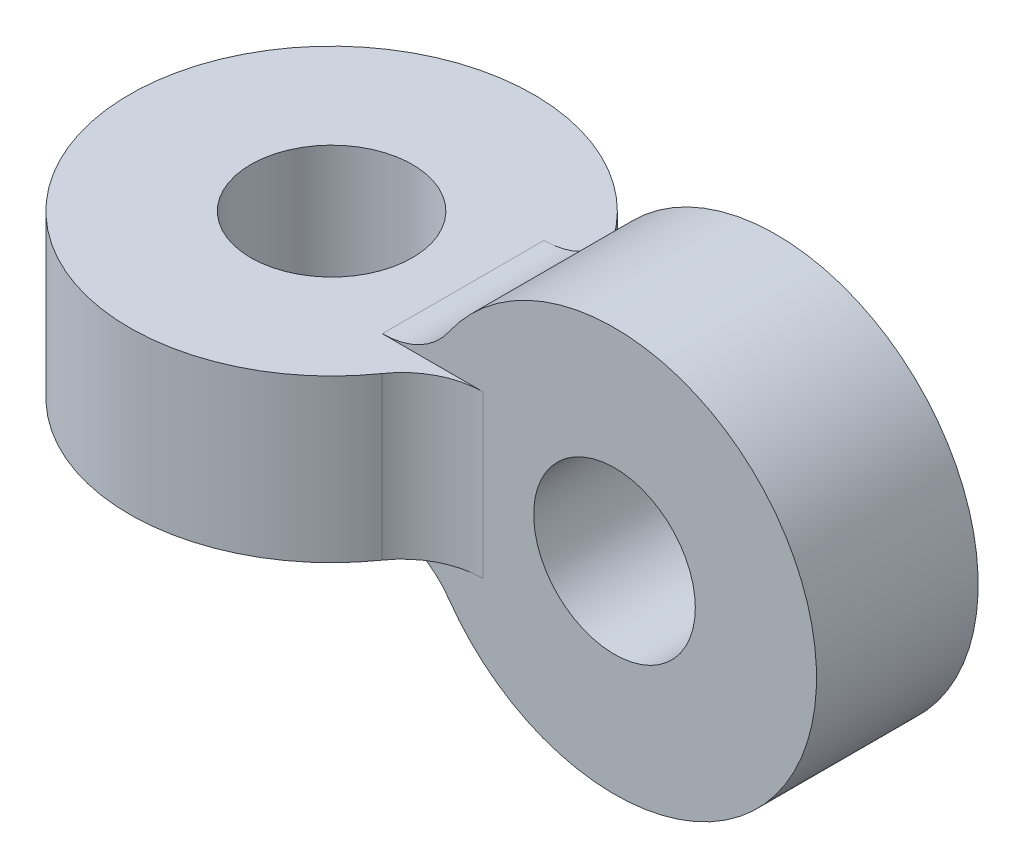
ISO-10303-21;
HEADER;
FILE_DESCRIPTION(('STEP AP214'),'2;1');
FILE_NAME('part.step','',(''),(''),'','','');
FILE_SCHEMA(('AUTOMOTIVE_DESIGN { 1 0 10303 214 1 1 1 1 }'));
ENDSEC;
DATA;
#1=APPLICATION_CONTEXT('core data for automotive mechanical design processes');
#2=APPLICATION_PROTOCOL_DEFINITION('international standard','automotive_design',2000,#1);
#3=PRODUCT_CONTEXT('',#1,'mechanical');
#4=PRODUCT('Part','Part','',(#3));
#5=PRODUCT_RELATED_PRODUCT_CATEGORY('part','',(#4));
#6=PRODUCT_DEFINITION_FORMATION('','',#4);
#7=PRODUCT_DEFINITION_CONTEXT('part definition',#1,'design');
#8=PRODUCT_DEFINITION('design','',#6,#7);
#9=PRODUCT_DEFINITION_SHAPE('','',#8);
#10=(LENGTH_UNIT() NAMED_UNIT(*) SI_UNIT(.MILLI.,.METRE.));
#11=(NAMED_UNIT(*) PLANE_ANGLE_UNIT() SI_UNIT($,.RADIAN.));
#12=(NAMED_UNIT(*) SI_UNIT($,.STERADIAN.) SOLID_ANGLE_UNIT());
#13=UNCERTAINTY_MEASURE_WITH_UNIT(LENGTH_MEASURE(1.E-05),#10,'distance_accuracy_value','');
#14=(GEOMETRIC_REPRESENTATION_CONTEXT(3) GLOBAL_UNCERTAINTY_ASSIGNED_CONTEXT((#13)) GLOBAL_UNIT_ASSIGNED_CONTEXT((#10,
#11,#12)) REPRESENTATION_CONTEXT('',''));
#15=CARTESIAN_POINT('',(0.,0.,0.));
#16=DIRECTION('',(0.,0.,1.));
#17=DIRECTION('',(1.,0.,0.));
#18=AXIS2_PLACEMENT_3D('',#15,#16,#17);
#19=CARTESIAN_POINT('',(0.,2.,0.));
#20=DIRECTION('',(0.,1.,0.));
#21=DIRECTION('',(0.,0.,1.));
#22=AXIS2_PLACEMENT_3D('',#19,#20,#21);
#23=PLANE('',#22);
#24=DIRECTION('',(0.,0.,-1.));
#25=VECTOR('',#24,1.);
#26=CARTESIAN_POINT('',(1.62771867673099,2.,0.));
#27=LINE('',#26,#25);
#28=CARTESIAN_POINT('',(1.62771867673099,2.,1.));
#29=VERTEX_POINT('',#28);
#30=CARTESIAN_POINT('',(1.62771867673099,2.,-1.));
#31=VERTEX_POINT('',#30);
#32=EDGE_CURVE('E102',#29,#31,#27,.T.);
#33=ORIENTED_EDGE('',*,*,#32,.T.);
#34=DIRECTION('',(1.,0.,0.));
#35=VECTOR('',#34,1.);
#36=CARTESIAN_POINT('',(0.,2.,-1.));
#37=LINE('',#36,#35);
#38=CARTESIAN_POINT('',(2.87228132326901,2.,-1.));
#39=VERTEX_POINT('',#38);
#40=EDGE_CURVE('E175',#31,#39,#37,.T.);
#41=ORIENTED_EDGE('',*,*,#40,.T.);
#42=CARTESIAN_POINT('',(2.87228132326901,2.,-2.));
#43=DIRECTION('',(0.,1.,0.));
#44=DIRECTION('',(0.,0.,1.));
#45=AXIS2_PLACEMENT_3D('',#42,#43,#44);
#46=CIRCLE('',#45,1.);
#47=CARTESIAN_POINT('',(2.05162951662072,2.,-1.42857142857143));
#48=VERTEX_POINT('',#47);
#49=EDGE_CURVE('E145',#39,#48,#46,.F.);
#50=ORIENTED_EDGE('',*,*,#49,.T.);
#51=CARTESIAN_POINT('',(0.,2.,0.));
#52=DIRECTION('',(0.,1.,0.));
#53=DIRECTION('',(0.,0.,1.));
#54=AXIS2_PLACEMENT_3D('',#51,#52,#53);
#55=CIRCLE('',#54,2.5);
#56=CARTESIAN_POINT('',(2.05162951662072,2.,1.42857142857143));
#57=VERTEX_POINT('',#56);
#58=EDGE_CURVE('E123',#48,#57,#55,.T.);
#59=ORIENTED_EDGE('',*,*,#58,.T.);
#60=CARTESIAN_POINT('',(2.87228132326901,2.,2.));
#61=DIRECTION('',(0.,1.,0.));
#62=DIRECTION('',(0.,0.,1.));
#63=AXIS2_PLACEMENT_3D('',#60,#61,#62);
#64=CIRCLE('',#63,1.);
#65=CARTESIAN_POINT('',(2.87228132326901,2.,1.));
#66=VERTEX_POINT('',#65);
#67=EDGE_CURVE('E45',#57,#66,#64,.F.);
#68=ORIENTED_EDGE('',*,*,#67,.T.);
#69=DIRECTION('',(1.,0.,0.));
#70=VECTOR('',#69,1.);
#71=CARTESIAN_POINT('',(0.,2.,1.));
#72=LINE('',#71,#70);
#73=EDGE_CURVE('E52',#29,#66,#72,.T.);
#74=ORIENTED_EDGE('',*,*,#73,.F.);
#75=EDGE_LOOP('',(#33,#41,#50,#59,#68,#74));
#76=FACE_BOUND('',#75,.T.);
#77=CARTESIAN_POINT('',(0.,2.,0.));
#78=DIRECTION('',(0.,1.,0.));
#79=DIRECTION('',(0.,0.,1.));
#80=AXIS2_PLACEMENT_3D('',#77,#78,#79);
#81=CIRCLE('',#80,1.);
#82=CARTESIAN_POINT('',(0.,2.,1.));
#83=VERTEX_POINT('',#82);
#84=EDGE_CURVE('E166',#83,#83,#81,.T.);
#85=ORIENTED_EDGE('',*,*,#84,.F.);
#86=EDGE_LOOP('',(#85));
#87=FACE_BOUND('',#86,.T.);
#88=ADVANCED_FACE('F37',(#76,#87),#23,.T.);
#89=CARTESIAN_POINT('',(0.,0.,0.));
#90=DIRECTION('',(0.,1.,0.));
#91=DIRECTION('',(0.,0.,1.));
#92=AXIS2_PLACEMENT_3D('',#89,#90,#91);
#93=PLANE('',#92);
#94=DIRECTION('',(1.,0.,0.));
#95=VECTOR('',#94,1.);
#96=CARTESIAN_POINT('',(0.,0.,-1.));
#97=LINE('',#96,#95);
#98=CARTESIAN_POINT('',(1.62771867673099,0.,-1.));
#99=VERTEX_POINT('',#98);
#100=CARTESIAN_POINT('',(2.87228132326901,0.,-1.));
#101=VERTEX_POINT('',#100);
#102=EDGE_CURVE('E177',#99,#101,#97,.T.);
#103=ORIENTED_EDGE('',*,*,#102,.F.);
#104=DIRECTION('',(0.,0.,1.));
#105=VECTOR('',#104,1.);
#106=CARTESIAN_POINT('',(1.62771867673099,0.,1.));
#107=LINE('',#106,#105);
#108=CARTESIAN_POINT('',(1.62771867673099,0.,1.));
#109=VERTEX_POINT('',#108);
#110=EDGE_CURVE('E133',#99,#109,#107,.T.);
#111=ORIENTED_EDGE('',*,*,#110,.T.);
#112=DIRECTION('',(1.,0.,0.));
#113=VECTOR('',#112,1.);
#114=CARTESIAN_POINT('',(0.,0.,1.));
#115=LINE('',#114,#113);
#116=CARTESIAN_POINT('',(2.87228132326901,0.,1.));
#117=VERTEX_POINT('',#116);
#118=EDGE_CURVE('E59',#109,#117,#115,.T.);
#119=ORIENTED_EDGE('',*,*,#118,.T.);
#120=CARTESIAN_POINT('',(2.87228132326901,0.,2.));
#121=DIRECTION('',(0.,1.,0.));
#122=DIRECTION('',(0.,0.,1.));
#123=AXIS2_PLACEMENT_3D('',#120,#121,#122);
#124=CIRCLE('',#123,1.);
#125=CARTESIAN_POINT('',(2.05162951662072,0.,1.42857142857143));
#126=VERTEX_POINT('',#125);
#127=EDGE_CURVE('E11',#117,#126,#124,.T.);
#128=ORIENTED_EDGE('',*,*,#127,.T.);
#129=CARTESIAN_POINT('',(0.,0.,0.));
#130=DIRECTION('',(0.,1.,0.));
#131=DIRECTION('',(0.,0.,1.));
#132=AXIS2_PLACEMENT_3D('',#129,#130,#131);
#133=CIRCLE('',#132,2.5);
#134=CARTESIAN_POINT('',(2.05162951662072,0.,-1.42857142857143));
#135=VERTEX_POINT('',#134);
#136=EDGE_CURVE('E126',#135,#126,#133,.T.);
#137=ORIENTED_EDGE('',*,*,#136,.F.);
#138=CARTESIAN_POINT('',(2.87228132326901,0.,-2.));
#139=DIRECTION('',(0.,1.,0.));
#140=DIRECTION('',(0.,0.,1.));
#141=AXIS2_PLACEMENT_3D('',#138,#139,#140);
#142=CIRCLE('',#141,1.);
#143=EDGE_CURVE('E147',#135,#101,#142,.T.);
#144=ORIENTED_EDGE('',*,*,#143,.T.);
#145=EDGE_LOOP('',(#103,#111,#119,#128,#137,#144));
#146=FACE_BOUND('',#145,.T.);
#147=CARTESIAN_POINT('',(0.,0.,0.));
#148=DIRECTION('',(0.,1.,0.));
#149=DIRECTION('',(0.,0.,1.));
#150=AXIS2_PLACEMENT_3D('',#147,#148,#149);
#151=CIRCLE('',#150,1.);
#152=CARTESIAN_POINT('',(0.,0.,1.));
#153=VERTEX_POINT('',#152);
#154=EDGE_CURVE('E105',#153,#153,#151,.T.);
#155=ORIENTED_EDGE('',*,*,#154,.T.);
#156=EDGE_LOOP('',(#155));
#157=FACE_BOUND('',#156,.T.);
#158=ADVANCED_FACE('F159',(#146,#157),#93,.F.);
#159=CARTESIAN_POINT('',(0.,2.,0.));
#160=DIRECTION('',(0.,-1.,0.));
#161=DIRECTION('',(0.,0.,-1.));
#162=AXIS2_PLACEMENT_3D('',#159,#160,#161);
#163=CYLINDRICAL_SURFACE('',#162,2.5);
#164=ORIENTED_EDGE('',*,*,#136,.T.);
#165=DIRECTION('',(0.,-1.,0.));
#166=VECTOR('',#165,1.);
#167=CARTESIAN_POINT('',(2.05162951662072,2.,1.42857142857143));
#168=LINE('',#167,#166);
#169=EDGE_CURVE('E150',#126,#57,#168,.F.);
#170=ORIENTED_EDGE('',*,*,#169,.T.);
#171=ORIENTED_EDGE('',*,*,#58,.F.);
#172=DIRECTION('',(0.,-1.,0.));
#173=VECTOR('',#172,1.);
#174=CARTESIAN_POINT('',(2.05162951662072,2.,-1.42857142857143));
#175=LINE('',#174,#173);
#176=EDGE_CURVE('E143',#48,#135,#175,.T.);
#177=ORIENTED_EDGE('',*,*,#176,.T.);
#178=EDGE_LOOP('',(#164,#170,#171,#177));
#179=FACE_BOUND('',#178,.T.);
#180=ADVANCED_FACE('F163',(#179),#163,.T.);
#181=CARTESIAN_POINT('',(0.,2.,0.));
#182=DIRECTION('',(0.,-1.,0.));
#183=DIRECTION('',(0.,0.,-1.));
#184=AXIS2_PLACEMENT_3D('',#181,#182,#183);
#185=CYLINDRICAL_SURFACE('',#184,1.);
#186=ORIENTED_EDGE('',*,*,#84,.T.);
#187=EDGE_LOOP('',(#186));
#188=FACE_BOUND('',#187,.T.);
#189=ORIENTED_EDGE('',*,*,#154,.F.);
#190=EDGE_LOOP('',(#189));
#191=FACE_BOUND('',#190,.T.);
#192=ADVANCED_FACE('F193',(#188,#191),#185,.F.);
#193=CARTESIAN_POINT('',(4.5,1.,1.));
#194=DIRECTION('',(0.,0.,1.));
#195=DIRECTION('',(1.,0.,0.));
#196=AXIS2_PLACEMENT_3D('',#193,#194,#195);
#197=PLANE('',#196);
#198=ORIENTED_EDGE('',*,*,#73,.T.);
#199=DIRECTION('',(0.,-1.,0.));
#200=VECTOR('',#199,1.);
#201=CARTESIAN_POINT('',(2.87228132326901,1.,1.));
#202=LINE('',#201,#200);
#203=EDGE_CURVE('E153',#66,#117,#202,.T.);
#204=ORIENTED_EDGE('',*,*,#203,.T.);
#205=ORIENTED_EDGE('',*,*,#118,.F.);
#206=CARTESIAN_POINT('',(1.62771867673099,-1.,1.));
#207=DIRECTION('',(0.,0.,1.));
#208=DIRECTION('',(1.,0.,0.));
#209=AXIS2_PLACEMENT_3D('',#206,#207,#208);
#210=CIRCLE('',#209,1.);
#211=CARTESIAN_POINT('',(2.44837048337928,-0.428571428571429,1.));
#212=VERTEX_POINT('',#211);
#213=EDGE_CURVE('E138',#109,#212,#210,.F.);
#214=ORIENTED_EDGE('',*,*,#213,.T.);
#215=CARTESIAN_POINT('',(4.5,1.,1.));
#216=DIRECTION('',(0.,0.,1.));
#217=DIRECTION('',(1.,0.,0.));
#218=AXIS2_PLACEMENT_3D('',#215,#216,#217);
#219=CIRCLE('',#218,2.5);
#220=CARTESIAN_POINT('',(2.44837048337927,2.42857142857143,1.));
#221=VERTEX_POINT('',#220);
#222=EDGE_CURVE('E112',#212,#221,#219,.T.);
#223=ORIENTED_EDGE('',*,*,#222,.T.);
#224=CARTESIAN_POINT('',(1.62771867673099,3.,1.));
#225=DIRECTION('',(0.,0.,1.));
#226=DIRECTION('',(1.,0.,0.));
#227=AXIS2_PLACEMENT_3D('',#224,#225,#226);
#228=CIRCLE('',#227,1.);
#229=EDGE_CURVE('E108',#221,#29,#228,.F.);
#230=ORIENTED_EDGE('',*,*,#229,.T.);
#231=EDGE_LOOP('',(#198,#204,#205,#214,#223,#230));
#232=FACE_BOUND('',#231,.T.);
#233=CARTESIAN_POINT('',(4.5,1.,1.));
#234=DIRECTION('',(0.,0.,1.));
#235=DIRECTION('',(1.,0.,0.));
#236=AXIS2_PLACEMENT_3D('',#233,#234,#235);
#237=CIRCLE('',#236,1.);
#238=CARTESIAN_POINT('',(5.5,1.,1.));
#239=VERTEX_POINT('',#238);
#240=EDGE_CURVE('E181',#239,#239,#237,.T.);
#241=ORIENTED_EDGE('',*,*,#240,.F.);
#242=EDGE_LOOP('',(#241));
#243=FACE_BOUND('',#242,.T.);
#244=ADVANCED_FACE('F109',(#232,#243),#197,.T.);
#245=CARTESIAN_POINT('',(4.5,1.,-1.));
#246=DIRECTION('',(0.,0.,1.));
#247=DIRECTION('',(1.,0.,0.));
#248=AXIS2_PLACEMENT_3D('',#245,#246,#247);
#249=PLANE('',#248);
#250=DIRECTION('',(0.,1.,0.));
#251=VECTOR('',#250,1.);
#252=CARTESIAN_POINT('',(2.87228132326901,2.,-1.));
#253=LINE('',#252,#251);
#254=EDGE_CURVE('E140',#101,#39,#253,.T.);
#255=ORIENTED_EDGE('',*,*,#254,.T.);
#256=ORIENTED_EDGE('',*,*,#40,.F.);
#257=CARTESIAN_POINT('',(1.62771867673099,3.,-1.));
#258=DIRECTION('',(0.,0.,1.));
#259=DIRECTION('',(1.,0.,0.));
#260=AXIS2_PLACEMENT_3D('',#257,#258,#259);
#261=CIRCLE('',#260,1.);
#262=CARTESIAN_POINT('',(2.44837048337927,2.42857142857143,-1.));
#263=VERTEX_POINT('',#262);
#264=EDGE_CURVE('E117',#31,#263,#261,.T.);
#265=ORIENTED_EDGE('',*,*,#264,.T.);
#266=CARTESIAN_POINT('',(4.5,1.,-1.));
#267=DIRECTION('',(0.,0.,1.));
#268=DIRECTION('',(1.,0.,0.));
#269=AXIS2_PLACEMENT_3D('',#266,#267,#268);
#270=CIRCLE('',#269,2.5);
#271=CARTESIAN_POINT('',(2.44837048337928,-0.428571428571429,-1.));
#272=VERTEX_POINT('',#271);
#273=EDGE_CURVE('E179',#272,#263,#270,.T.);
#274=ORIENTED_EDGE('',*,*,#273,.F.);
#275=CARTESIAN_POINT('',(1.62771867673099,-1.,-1.));
#276=DIRECTION('',(0.,0.,1.));
#277=DIRECTION('',(1.,0.,0.));
#278=AXIS2_PLACEMENT_3D('',#275,#276,#277);
#279=CIRCLE('',#278,1.);
#280=EDGE_CURVE('E135',#272,#99,#279,.T.);
#281=ORIENTED_EDGE('',*,*,#280,.T.);
#282=ORIENTED_EDGE('',*,*,#102,.T.);
#283=EDGE_LOOP('',(#255,#256,#265,#274,#281,#282));
#284=FACE_BOUND('',#283,.T.);
#285=CARTESIAN_POINT('',(4.5,1.,-1.));
#286=DIRECTION('',(0.,0.,1.));
#287=DIRECTION('',(1.,0.,0.));
#288=AXIS2_PLACEMENT_3D('',#285,#286,#287);
#289=CIRCLE('',#288,1.);
#290=CARTESIAN_POINT('',(5.5,1.,-1.));
#291=VERTEX_POINT('',#290);
#292=EDGE_CURVE('E183',#291,#291,#289,.T.);
#293=ORIENTED_EDGE('',*,*,#292,.T.);
#294=EDGE_LOOP('',(#293));
#295=FACE_BOUND('',#294,.T.);
#296=ADVANCED_FACE('F192',(#284,#295),#249,.F.);
#297=CARTESIAN_POINT('',(4.5,1.,1.));
#298=DIRECTION('',(0.,0.,-1.));
#299=DIRECTION('',(-1.,0.,0.));
#300=AXIS2_PLACEMENT_3D('',#297,#298,#299);
#301=CYLINDRICAL_SURFACE('',#300,2.5);
#302=ORIENTED_EDGE('',*,*,#222,.F.);
#303=DIRECTION('',(0.,0.,-1.));
#304=VECTOR('',#303,1.);
#305=CARTESIAN_POINT('',(2.44837048337927,-0.428571428571429,1.));
#306=LINE('',#305,#304);
#307=EDGE_CURVE('E116',#212,#272,#306,.T.);
#308=ORIENTED_EDGE('',*,*,#307,.T.);
#309=ORIENTED_EDGE('',*,*,#273,.T.);
#310=DIRECTION('',(0.,0.,-1.));
#311=VECTOR('',#310,1.);
#312=CARTESIAN_POINT('',(2.44837048337928,2.42857142857143,1.));
#313=LINE('',#312,#311);
#314=EDGE_CURVE('E122',#263,#221,#313,.F.);
#315=ORIENTED_EDGE('',*,*,#314,.T.);
#316=EDGE_LOOP('',(#302,#308,#309,#315));
#317=FACE_BOUND('',#316,.T.);
#318=ADVANCED_FACE('F199',(#317),#301,.T.);
#319=CARTESIAN_POINT('',(4.5,1.,1.));
#320=DIRECTION('',(0.,0.,-1.));
#321=DIRECTION('',(-1.,0.,0.));
#322=AXIS2_PLACEMENT_3D('',#319,#320,#321);
#323=CYLINDRICAL_SURFACE('',#322,1.);
#324=ORIENTED_EDGE('',*,*,#240,.T.);
#325=EDGE_LOOP('',(#324));
#326=FACE_BOUND('',#325,.T.);
#327=ORIENTED_EDGE('',*,*,#292,.F.);
#328=EDGE_LOOP('',(#327));
#329=FACE_BOUND('',#328,.T.);
#330=ADVANCED_FACE('F189',(#326,#329),#323,.F.);
#331=CARTESIAN_POINT('',(1.62771867673099,3.,1.));
#332=DIRECTION('',(0.,0.,-1.));
#333=DIRECTION('',(-1.,0.,0.));
#334=AXIS2_PLACEMENT_3D('',#331,#332,#333);
#335=CYLINDRICAL_SURFACE('',#334,1.);
#336=ORIENTED_EDGE('',*,*,#229,.F.);
#337=ORIENTED_EDGE('',*,*,#314,.F.);
#338=ORIENTED_EDGE('',*,*,#264,.F.);
#339=ORIENTED_EDGE('',*,*,#32,.F.);
#340=EDGE_LOOP('',(#336,#337,#338,#339));
#341=FACE_BOUND('',#340,.T.);
#342=ADVANCED_FACE('F120',(#341),#335,.F.);
#343=CARTESIAN_POINT('',(1.62771867673099,-1.,1.));
#344=DIRECTION('',(0.,0.,-1.));
#345=DIRECTION('',(-1.,0.,0.));
#346=AXIS2_PLACEMENT_3D('',#343,#344,#345);
#347=CYLINDRICAL_SURFACE('',#346,1.);
#348=ORIENTED_EDGE('',*,*,#213,.F.);
#349=ORIENTED_EDGE('',*,*,#110,.F.);
#350=ORIENTED_EDGE('',*,*,#280,.F.);
#351=ORIENTED_EDGE('',*,*,#307,.F.);
#352=EDGE_LOOP('',(#348,#349,#350,#351));
#353=FACE_BOUND('',#352,.T.);
#354=ADVANCED_FACE('F216',(#353),#347,.F.);
#355=CARTESIAN_POINT('',(2.87228132326901,2.,-2.));
#356=DIRECTION('',(0.,-1.,0.));
#357=DIRECTION('',(0.,0.,-1.));
#358=AXIS2_PLACEMENT_3D('',#355,#356,#357);
#359=CYLINDRICAL_SURFACE('',#358,1.);
#360=ORIENTED_EDGE('',*,*,#143,.F.);
#361=ORIENTED_EDGE('',*,*,#176,.F.);
#362=ORIENTED_EDGE('',*,*,#49,.F.);
#363=ORIENTED_EDGE('',*,*,#254,.F.);
#364=EDGE_LOOP('',(#360,#361,#362,#363));
#365=FACE_BOUND('',#364,.T.);
#366=ADVANCED_FACE('F218',(#365),#359,.F.);
#367=CARTESIAN_POINT('',(2.87228132326901,2.,2.));
#368=DIRECTION('',(0.,-1.,0.));
#369=DIRECTION('',(0.,0.,-1.));
#370=AXIS2_PLACEMENT_3D('',#367,#368,#369);
#371=CYLINDRICAL_SURFACE('',#370,1.);
#372=ORIENTED_EDGE('',*,*,#127,.F.);
#373=ORIENTED_EDGE('',*,*,#203,.F.);
#374=ORIENTED_EDGE('',*,*,#67,.F.);
#375=ORIENTED_EDGE('',*,*,#169,.F.);
#376=EDGE_LOOP('',(#372,#373,#374,#375));
#377=FACE_BOUND('',#376,.T.);
#378=ADVANCED_FACE('F39',(#377),#371,.F.);
#379=CLOSED_SHELL('',(#88,#158,#180,#192,#244,#296,#318,#330,#342,#354,#366,#378));
#380=MANIFOLD_SOLID_BREP('B2',#379);
#381=ADVANCED_BREP_SHAPE_REPRESENTATION('',(#18,#380),#14);
#382=SHAPE_DEFINITION_REPRESENTATION(#9,#381);
ENDSEC;
END-ISO-10303-21;
